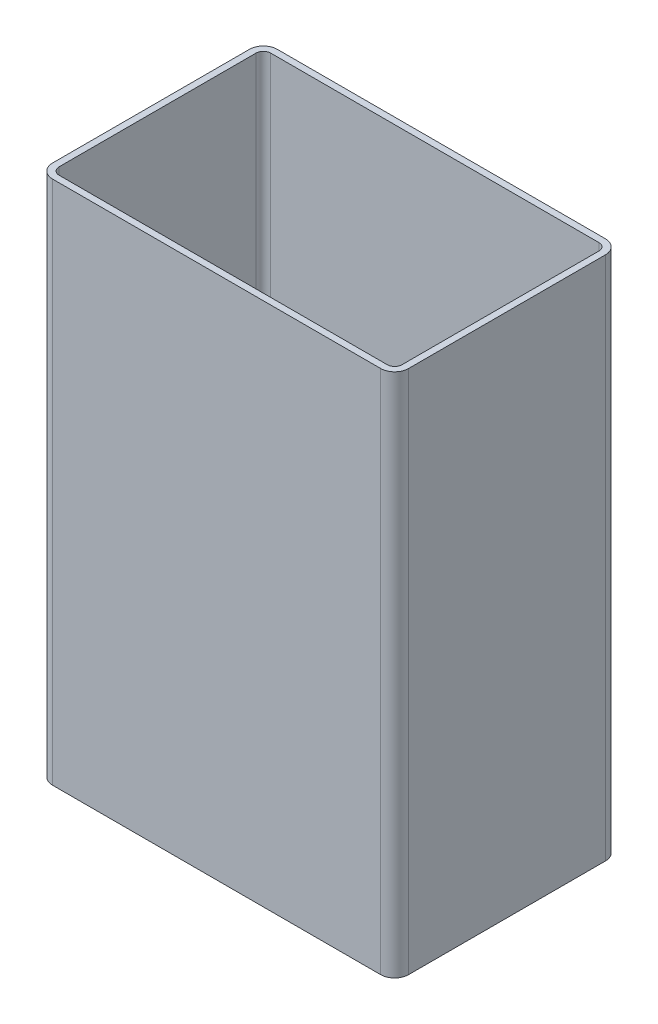
ISO-10303-21;
HEADER;
FILE_DESCRIPTION(('STEP AP214'),'2;1');
FILE_NAME('part.step','',(''),(''),'','','');
FILE_SCHEMA(('AUTOMOTIVE_DESIGN { 1 0 10303 214 1 1 1 1 }'));
ENDSEC;
DATA;
#1=APPLICATION_CONTEXT('core data for automotive mechanical design processes');
#2=APPLICATION_PROTOCOL_DEFINITION('international standard','automotive_design',2000,#1);
#3=PRODUCT_CONTEXT('',#1,'mechanical');
#4=PRODUCT('Part','Part','',(#3));
#5=PRODUCT_RELATED_PRODUCT_CATEGORY('part','',(#4));
#6=PRODUCT_DEFINITION_FORMATION('','',#4);
#7=PRODUCT_DEFINITION_CONTEXT('part definition',#1,'design');
#8=PRODUCT_DEFINITION('design','',#6,#7);
#9=PRODUCT_DEFINITION_SHAPE('','',#8);
#10=(LENGTH_UNIT() NAMED_UNIT(*) SI_UNIT(.MILLI.,.METRE.));
#11=(NAMED_UNIT(*) PLANE_ANGLE_UNIT() SI_UNIT($,.RADIAN.));
#12=(NAMED_UNIT(*) SI_UNIT($,.STERADIAN.) SOLID_ANGLE_UNIT());
#13=UNCERTAINTY_MEASURE_WITH_UNIT(LENGTH_MEASURE(1.E-05),#10,'distance_accuracy_value','');
#14=(GEOMETRIC_REPRESENTATION_CONTEXT(3) GLOBAL_UNCERTAINTY_ASSIGNED_CONTEXT((#13)) GLOBAL_UNIT_ASSIGNED_CONTEXT((#10,
#11,#12)) REPRESENTATION_CONTEXT('',''));
#15=CARTESIAN_POINT('',(0.,0.,0.));
#16=DIRECTION('',(0.,0.,1.));
#17=DIRECTION('',(1.,0.,0.));
#18=AXIS2_PLACEMENT_3D('',#15,#16,#17);
#19=CARTESIAN_POINT('',(0.,-609.6,-16.1798));
#20=DIRECTION('',(0.,1.,0.));
#21=DIRECTION('',(0.,0.,1.));
#22=AXIS2_PLACEMENT_3D('',#19,#20,#21);
#23=CYLINDRICAL_SURFACE('',#22,16.1798);
#24=CARTESIAN_POINT('',(0.,0.,-16.1798));
#25=DIRECTION('',(0.,-1.,0.));
#26=DIRECTION('',(0.,0.,-1.));
#27=AXIS2_PLACEMENT_3D('',#24,#25,#26);
#28=CIRCLE('',#27,16.1798);
#29=CARTESIAN_POINT('',(0.,0.,0.));
#30=VERTEX_POINT('',#29);
#31=CARTESIAN_POINT('',(-16.1798,0.,-16.1798));
#32=VERTEX_POINT('',#31);
#33=EDGE_CURVE('E142',#30,#32,#28,.T.);
#34=ORIENTED_EDGE('',*,*,#33,.T.);
#35=DIRECTION('',(0.,1.,0.));
#36=VECTOR('',#35,1.);
#37=CARTESIAN_POINT('',(-16.1798,-609.6,-16.1798));
#38=LINE('',#37,#36);
#39=CARTESIAN_POINT('',(-16.1798,-609.6,-16.1798));
#40=VERTEX_POINT('',#39);
#41=EDGE_CURVE('E11',#40,#32,#38,.T.);
#42=ORIENTED_EDGE('',*,*,#41,.F.);
#43=CARTESIAN_POINT('',(0.,-609.6,-16.1798));
#44=DIRECTION('',(0.,-1.,0.));
#45=DIRECTION('',(0.,0.,-1.));
#46=AXIS2_PLACEMENT_3D('',#43,#44,#45);
#47=CIRCLE('',#46,16.1798);
#48=CARTESIAN_POINT('',(0.,-609.6,0.));
#49=VERTEX_POINT('',#48);
#50=EDGE_CURVE('E162',#49,#40,#47,.T.);
#51=ORIENTED_EDGE('',*,*,#50,.F.);
#52=DIRECTION('',(0.,1.,0.));
#53=VECTOR('',#52,1.);
#54=CARTESIAN_POINT('',(0.,-609.6,0.));
#55=LINE('',#54,#53);
#56=EDGE_CURVE('E56',#49,#30,#55,.T.);
#57=ORIENTED_EDGE('',*,*,#56,.T.);
#58=EDGE_LOOP('',(#34,#42,#51,#57));
#59=FACE_BOUND('',#58,.T.);
#60=ADVANCED_FACE('F33',(#59),#23,.T.);
#61=CARTESIAN_POINT('',(-16.1798,-609.6,-16.1798));
#62=DIRECTION('',(1.,0.,0.));
#63=DIRECTION('',(0.,0.,-1.));
#64=AXIS2_PLACEMENT_3D('',#61,#62,#63);
#65=PLANE('',#64);
#66=DIRECTION('',(0.,0.,-1.));
#67=VECTOR('',#66,1.);
#68=CARTESIAN_POINT('',(-16.1798,0.,-16.1798));
#69=LINE('',#68,#67);
#70=CARTESIAN_POINT('',(-16.1798,0.,-244.7798));
#71=VERTEX_POINT('',#70);
#72=EDGE_CURVE('E144',#32,#71,#69,.T.);
#73=ORIENTED_EDGE('',*,*,#72,.T.);
#74=DIRECTION('',(0.,1.,0.));
#75=VECTOR('',#74,1.);
#76=CARTESIAN_POINT('',(-16.1798,-609.6,-244.7798));
#77=LINE('',#76,#75);
#78=CARTESIAN_POINT('',(-16.1798,-609.6,-244.7798));
#79=VERTEX_POINT('',#78);
#80=EDGE_CURVE('E40',#79,#71,#77,.T.);
#81=ORIENTED_EDGE('',*,*,#80,.F.);
#82=DIRECTION('',(0.,0.,-1.));
#83=VECTOR('',#82,1.);
#84=CARTESIAN_POINT('',(-16.1798,-609.6,-16.1798));
#85=LINE('',#84,#83);
#86=EDGE_CURVE('E95',#40,#79,#85,.T.);
#87=ORIENTED_EDGE('',*,*,#86,.F.);
#88=ORIENTED_EDGE('',*,*,#41,.T.);
#89=EDGE_LOOP('',(#73,#81,#87,#88));
#90=FACE_BOUND('',#89,.T.);
#91=ADVANCED_FACE('F176',(#90),#65,.F.);
#92=CARTESIAN_POINT('',(0.,-609.6,-244.7798));
#93=DIRECTION('',(0.,1.,0.));
#94=DIRECTION('',(0.,0.,1.));
#95=AXIS2_PLACEMENT_3D('',#92,#93,#94);
#96=CYLINDRICAL_SURFACE('',#95,16.1798);
#97=CARTESIAN_POINT('',(0.,0.,-244.7798));
#98=DIRECTION('',(0.,1.,0.));
#99=DIRECTION('',(0.,0.,1.));
#100=AXIS2_PLACEMENT_3D('',#97,#98,#99);
#101=CIRCLE('',#100,16.1798);
#102=CARTESIAN_POINT('',(0.,0.,-260.9596));
#103=VERTEX_POINT('',#102);
#104=EDGE_CURVE('E148',#103,#71,#101,.T.);
#105=ORIENTED_EDGE('',*,*,#104,.F.);
#106=DIRECTION('',(0.,1.,0.));
#107=VECTOR('',#106,1.);
#108=CARTESIAN_POINT('',(0.,-609.6,-260.9596));
#109=LINE('',#108,#107);
#110=CARTESIAN_POINT('',(0.,-609.6,-260.9596));
#111=VERTEX_POINT('',#110);
#112=EDGE_CURVE('E169',#111,#103,#109,.T.);
#113=ORIENTED_EDGE('',*,*,#112,.F.);
#114=CARTESIAN_POINT('',(0.,-609.6,-244.7798));
#115=DIRECTION('',(0.,1.,0.));
#116=DIRECTION('',(0.,0.,1.));
#117=AXIS2_PLACEMENT_3D('',#114,#115,#116);
#118=CIRCLE('',#117,16.1798);
#119=EDGE_CURVE('E175',#111,#79,#118,.T.);
#120=ORIENTED_EDGE('',*,*,#119,.T.);
#121=ORIENTED_EDGE('',*,*,#80,.T.);
#122=EDGE_LOOP('',(#105,#113,#120,#121));
#123=FACE_BOUND('',#122,.T.);
#124=ADVANCED_FACE('F173',(#123),#96,.T.);
#125=CARTESIAN_POINT('',(0.,-609.6,-260.9596));
#126=DIRECTION('',(0.,0.,1.));
#127=DIRECTION('',(1.,0.,0.));
#128=AXIS2_PLACEMENT_3D('',#125,#126,#127);
#129=PLANE('',#128);
#130=DIRECTION('',(1.,0.,0.));
#131=VECTOR('',#130,1.);
#132=CARTESIAN_POINT('',(0.,0.,-260.9596));
#133=LINE('',#132,#131);
#134=CARTESIAN_POINT('',(381.,0.,-260.9596));
#135=VERTEX_POINT('',#134);
#136=EDGE_CURVE('E151',#103,#135,#133,.T.);
#137=ORIENTED_EDGE('',*,*,#136,.T.);
#138=DIRECTION('',(0.,1.,0.));
#139=VECTOR('',#138,1.);
#140=CARTESIAN_POINT('',(381.,-609.6,-260.9596));
#141=LINE('',#140,#139);
#142=CARTESIAN_POINT('',(381.,-609.6,-260.9596));
#143=VERTEX_POINT('',#142);
#144=EDGE_CURVE('E166',#143,#135,#141,.T.);
#145=ORIENTED_EDGE('',*,*,#144,.F.);
#146=DIRECTION('',(1.,0.,0.));
#147=VECTOR('',#146,1.);
#148=CARTESIAN_POINT('',(0.,-609.6,-260.9596));
#149=LINE('',#148,#147);
#150=EDGE_CURVE('E188',#111,#143,#149,.T.);
#151=ORIENTED_EDGE('',*,*,#150,.F.);
#152=ORIENTED_EDGE('',*,*,#112,.T.);
#153=EDGE_LOOP('',(#137,#145,#151,#152));
#154=FACE_BOUND('',#153,.T.);
#155=ADVANCED_FACE('F184',(#154),#129,.F.);
#156=CARTESIAN_POINT('',(381.,-609.6,-244.7798));
#157=DIRECTION('',(0.,1.,0.));
#158=DIRECTION('',(0.,0.,1.));
#159=AXIS2_PLACEMENT_3D('',#156,#157,#158);
#160=CYLINDRICAL_SURFACE('',#159,16.1798);
#161=CARTESIAN_POINT('',(381.,0.,-244.7798));
#162=DIRECTION('',(0.,-1.,0.));
#163=DIRECTION('',(0.,0.,-1.));
#164=AXIS2_PLACEMENT_3D('',#161,#162,#163);
#165=CIRCLE('',#164,16.1798);
#166=CARTESIAN_POINT('',(397.1798,0.,-244.7798));
#167=VERTEX_POINT('',#166);
#168=EDGE_CURVE('E153',#135,#167,#165,.T.);
#169=ORIENTED_EDGE('',*,*,#168,.T.);
#170=DIRECTION('',(0.,1.,0.));
#171=VECTOR('',#170,1.);
#172=CARTESIAN_POINT('',(397.1798,-609.6,-244.7798));
#173=LINE('',#172,#171);
#174=CARTESIAN_POINT('',(397.1798,-609.6,-244.7798));
#175=VERTEX_POINT('',#174);
#176=EDGE_CURVE('E124',#175,#167,#173,.T.);
#177=ORIENTED_EDGE('',*,*,#176,.F.);
#178=CARTESIAN_POINT('',(381.,-609.6,-244.7798));
#179=DIRECTION('',(0.,-1.,0.));
#180=DIRECTION('',(0.,0.,-1.));
#181=AXIS2_PLACEMENT_3D('',#178,#179,#180);
#182=CIRCLE('',#181,16.1798);
#183=EDGE_CURVE('E133',#143,#175,#182,.T.);
#184=ORIENTED_EDGE('',*,*,#183,.F.);
#185=ORIENTED_EDGE('',*,*,#144,.T.);
#186=EDGE_LOOP('',(#169,#177,#184,#185));
#187=FACE_BOUND('',#186,.T.);
#188=ADVANCED_FACE('F187',(#187),#160,.T.);
#189=CARTESIAN_POINT('',(397.1798,-609.6,-16.1798));
#190=DIRECTION('',(1.,0.,0.));
#191=DIRECTION('',(0.,0.,-1.));
#192=AXIS2_PLACEMENT_3D('',#189,#190,#191);
#193=PLANE('',#192);
#194=DIRECTION('',(0.,0.,-1.));
#195=VECTOR('',#194,1.);
#196=CARTESIAN_POINT('',(397.1798,0.,-16.1798));
#197=LINE('',#196,#195);
#198=CARTESIAN_POINT('',(397.1798,0.,-16.1798));
#199=VERTEX_POINT('',#198);
#200=EDGE_CURVE('E119',#199,#167,#197,.T.);
#201=ORIENTED_EDGE('',*,*,#200,.F.);
#202=DIRECTION('',(0.,1.,0.));
#203=VECTOR('',#202,1.);
#204=CARTESIAN_POINT('',(397.1798,-609.6,-16.1798));
#205=LINE('',#204,#203);
#206=CARTESIAN_POINT('',(397.1798,-609.6,-16.1798));
#207=VERTEX_POINT('',#206);
#208=EDGE_CURVE('E114',#207,#199,#205,.T.);
#209=ORIENTED_EDGE('',*,*,#208,.F.);
#210=DIRECTION('',(0.,0.,-1.));
#211=VECTOR('',#210,1.);
#212=CARTESIAN_POINT('',(397.1798,-609.6,-16.1798));
#213=LINE('',#212,#211);
#214=EDGE_CURVE('E117',#207,#175,#213,.T.);
#215=ORIENTED_EDGE('',*,*,#214,.T.);
#216=ORIENTED_EDGE('',*,*,#176,.T.);
#217=EDGE_LOOP('',(#201,#209,#215,#216));
#218=FACE_BOUND('',#217,.T.);
#219=ADVANCED_FACE('F116',(#218),#193,.T.);
#220=CARTESIAN_POINT('',(381.,-609.6,-16.1798));
#221=DIRECTION('',(0.,1.,0.));
#222=DIRECTION('',(0.,0.,1.));
#223=AXIS2_PLACEMENT_3D('',#220,#221,#222);
#224=CYLINDRICAL_SURFACE('',#223,16.1798);
#225=CARTESIAN_POINT('',(381.,0.,-16.1798));
#226=DIRECTION('',(0.,1.,0.));
#227=DIRECTION('',(0.,0.,1.));
#228=AXIS2_PLACEMENT_3D('',#225,#226,#227);
#229=CIRCLE('',#228,16.1798);
#230=CARTESIAN_POINT('',(381.,0.,0.));
#231=VERTEX_POINT('',#230);
#232=EDGE_CURVE('E157',#231,#199,#229,.T.);
#233=ORIENTED_EDGE('',*,*,#232,.F.);
#234=DIRECTION('',(0.,1.,0.));
#235=VECTOR('',#234,1.);
#236=CARTESIAN_POINT('',(381.,-609.6,0.));
#237=LINE('',#236,#235);
#238=CARTESIAN_POINT('',(381.,-609.6,0.));
#239=VERTEX_POINT('',#238);
#240=EDGE_CURVE('E125',#239,#231,#237,.T.);
#241=ORIENTED_EDGE('',*,*,#240,.F.);
#242=CARTESIAN_POINT('',(381.,-609.6,-16.1798));
#243=DIRECTION('',(0.,1.,0.));
#244=DIRECTION('',(0.,0.,1.));
#245=AXIS2_PLACEMENT_3D('',#242,#243,#244);
#246=CIRCLE('',#245,16.1798);
#247=EDGE_CURVE('E131',#239,#207,#246,.T.);
#248=ORIENTED_EDGE('',*,*,#247,.T.);
#249=ORIENTED_EDGE('',*,*,#208,.T.);
#250=EDGE_LOOP('',(#233,#241,#248,#249));
#251=FACE_BOUND('',#250,.T.);
#252=ADVANCED_FACE('F136',(#251),#224,.T.);
#253=CARTESIAN_POINT('',(0.,-609.6,0.));
#254=DIRECTION('',(0.,0.,1.));
#255=DIRECTION('',(1.,0.,0.));
#256=AXIS2_PLACEMENT_3D('',#253,#254,#255);
#257=PLANE('',#256);
#258=DIRECTION('',(1.,0.,0.));
#259=VECTOR('',#258,1.);
#260=CARTESIAN_POINT('',(0.,0.,0.));
#261=LINE('',#260,#259);
#262=EDGE_CURVE('E159',#30,#231,#261,.T.);
#263=ORIENTED_EDGE('',*,*,#262,.F.);
#264=ORIENTED_EDGE('',*,*,#56,.F.);
#265=DIRECTION('',(1.,0.,0.));
#266=VECTOR('',#265,1.);
#267=CARTESIAN_POINT('',(0.,-609.6,0.));
#268=LINE('',#267,#266);
#269=EDGE_CURVE('E137',#49,#239,#268,.T.);
#270=ORIENTED_EDGE('',*,*,#269,.T.);
#271=ORIENTED_EDGE('',*,*,#240,.T.);
#272=EDGE_LOOP('',(#263,#264,#270,#271));
#273=FACE_BOUND('',#272,.T.);
#274=ADVANCED_FACE('F327',(#273),#257,.T.);
#275=CARTESIAN_POINT('',(0.,-609.6,-16.1798));
#276=DIRECTION('',(0.,-1.,0.));
#277=DIRECTION('',(0.,0.,-1.));
#278=AXIS2_PLACEMENT_3D('',#275,#276,#277);
#279=PLANE('',#278);
#280=ORIENTED_EDGE('',*,*,#50,.T.);
#281=ORIENTED_EDGE('',*,*,#86,.T.);
#282=ORIENTED_EDGE('',*,*,#119,.F.);
#283=ORIENTED_EDGE('',*,*,#150,.T.);
#284=ORIENTED_EDGE('',*,*,#183,.T.);
#285=ORIENTED_EDGE('',*,*,#214,.F.);
#286=ORIENTED_EDGE('',*,*,#247,.F.);
#287=ORIENTED_EDGE('',*,*,#269,.F.);
#288=EDGE_LOOP('',(#280,#281,#282,#283,#284,#285,#286,#287));
#289=FACE_BOUND('',#288,.T.);
#290=ADVANCED_FACE('F129',(#289),#279,.T.);
#291=CARTESIAN_POINT('',(0.,0.,-16.1798));
#292=DIRECTION('',(0.,-1.,0.));
#293=DIRECTION('',(0.,0.,-1.));
#294=AXIS2_PLACEMENT_3D('',#291,#292,#293);
#295=PLANE('',#294);
#296=DIRECTION('',(1.,0.,0.));
#297=VECTOR('',#296,1.);
#298=CARTESIAN_POINT('',(0.,0.,-7.62));
#299=LINE('',#298,#297);
#300=CARTESIAN_POINT('',(0.,-2.22044604925031E-13,-7.62000000000002));
#301=VERTEX_POINT('',#300);
#302=CARTESIAN_POINT('',(381.,-2.22044604925031E-13,-7.62));
#303=VERTEX_POINT('',#302);
#304=EDGE_CURVE('E211',#301,#303,#299,.T.);
#305=ORIENTED_EDGE('',*,*,#304,.F.);
#306=CARTESIAN_POINT('',(0.,0.,-16.1798));
#307=DIRECTION('',(0.,-1.,0.));
#308=DIRECTION('',(0.,0.,-1.));
#309=AXIS2_PLACEMENT_3D('',#306,#307,#308);
#310=CIRCLE('',#309,8.55979999999998);
#311=CARTESIAN_POINT('',(-8.55979999999997,-2.22044604925031E-13,-16.1798));
#312=VERTEX_POINT('',#311);
#313=EDGE_CURVE('E197',#301,#312,#310,.T.);
#314=ORIENTED_EDGE('',*,*,#313,.T.);
#315=DIRECTION('',(0.,0.,-1.));
#316=VECTOR('',#315,1.);
#317=CARTESIAN_POINT('',(-8.55979999999997,0.,-16.1798));
#318=LINE('',#317,#316);
#319=CARTESIAN_POINT('',(-8.55979999999998,-2.22044604925031E-13,-244.7798));
#320=VERTEX_POINT('',#319);
#321=EDGE_CURVE('E194',#312,#320,#318,.T.);
#322=ORIENTED_EDGE('',*,*,#321,.T.);
#323=CARTESIAN_POINT('',(0.,0.,-244.7798));
#324=DIRECTION('',(0.,-1.,0.));
#325=DIRECTION('',(0.,0.,-1.));
#326=AXIS2_PLACEMENT_3D('',#323,#324,#325);
#327=CIRCLE('',#326,8.55979999999998);
#328=CARTESIAN_POINT('',(0.,-2.22044604925031E-13,-253.3396));
#329=VERTEX_POINT('',#328);
#330=EDGE_CURVE('E47',#329,#320,#327,.F.);
#331=ORIENTED_EDGE('',*,*,#330,.F.);
#332=DIRECTION('',(1.,0.,0.));
#333=VECTOR('',#332,1.);
#334=CARTESIAN_POINT('',(0.,0.,-253.3396));
#335=LINE('',#334,#333);
#336=CARTESIAN_POINT('',(381.,-2.22044604925031E-13,-253.3396));
#337=VERTEX_POINT('',#336);
#338=EDGE_CURVE('E199',#329,#337,#335,.T.);
#339=ORIENTED_EDGE('',*,*,#338,.T.);
#340=CARTESIAN_POINT('',(381.,0.,-244.7798));
#341=DIRECTION('',(0.,-1.,0.));
#342=DIRECTION('',(0.,0.,-1.));
#343=AXIS2_PLACEMENT_3D('',#340,#341,#342);
#344=CIRCLE('',#343,8.55979999999998);
#345=CARTESIAN_POINT('',(389.5598,-2.22044604925031E-13,-244.7798));
#346=VERTEX_POINT('',#345);
#347=EDGE_CURVE('E202',#337,#346,#344,.T.);
#348=ORIENTED_EDGE('',*,*,#347,.T.);
#349=DIRECTION('',(0.,0.,-1.));
#350=VECTOR('',#349,1.);
#351=CARTESIAN_POINT('',(389.5598,0.,-16.1798));
#352=LINE('',#351,#350);
#353=CARTESIAN_POINT('',(389.5598,-2.22044604925031E-13,-16.1798));
#354=VERTEX_POINT('',#353);
#355=EDGE_CURVE('E205',#354,#346,#352,.T.);
#356=ORIENTED_EDGE('',*,*,#355,.F.);
#357=CARTESIAN_POINT('',(381.,0.,-16.1798));
#358=DIRECTION('',(0.,-1.,0.));
#359=DIRECTION('',(0.,0.,-1.));
#360=AXIS2_PLACEMENT_3D('',#357,#358,#359);
#361=CIRCLE('',#360,8.55979999999998);
#362=EDGE_CURVE('E208',#303,#354,#361,.F.);
#363=ORIENTED_EDGE('',*,*,#362,.F.);
#364=EDGE_LOOP('',(#305,#314,#322,#331,#339,#348,#356,#363));
#365=FACE_BOUND('',#364,.T.);
#366=ORIENTED_EDGE('',*,*,#33,.F.);
#367=ORIENTED_EDGE('',*,*,#262,.T.);
#368=ORIENTED_EDGE('',*,*,#232,.T.);
#369=ORIENTED_EDGE('',*,*,#200,.T.);
#370=ORIENTED_EDGE('',*,*,#168,.F.);
#371=ORIENTED_EDGE('',*,*,#136,.F.);
#372=ORIENTED_EDGE('',*,*,#104,.T.);
#373=ORIENTED_EDGE('',*,*,#72,.F.);
#374=EDGE_LOOP('',(#366,#367,#368,#369,#370,#371,#372,#373));
#375=FACE_BOUND('',#374,.T.);
#376=ADVANCED_FACE('F180',(#365,#375),#295,.F.);
#377=CARTESIAN_POINT('',(0.,-609.6,-16.1798));
#378=DIRECTION('',(0.,1.,0.));
#379=DIRECTION('',(0.,0.,1.));
#380=AXIS2_PLACEMENT_3D('',#377,#378,#379);
#381=CYLINDRICAL_SURFACE('',#380,8.55979999999998);
#382=ORIENTED_EDGE('',*,*,#313,.F.);
#383=DIRECTION('',(0.,1.,0.));
#384=VECTOR('',#383,1.);
#385=CARTESIAN_POINT('',(0.,-609.6,-7.62000000000002));
#386=LINE('',#385,#384);
#387=CARTESIAN_POINT('',(0.,-601.98,-7.62000000000002));
#388=VERTEX_POINT('',#387);
#389=EDGE_CURVE('E220',#388,#301,#386,.T.);
#390=ORIENTED_EDGE('',*,*,#389,.F.);
#391=CARTESIAN_POINT('',(0.,-601.98,-16.1798));
#392=DIRECTION('',(0.,-1.,0.));
#393=DIRECTION('',(0.,0.,-1.));
#394=AXIS2_PLACEMENT_3D('',#391,#392,#393);
#395=CIRCLE('',#394,8.55979999999998);
#396=CARTESIAN_POINT('',(-8.55979999999997,-601.98,-16.1798));
#397=VERTEX_POINT('',#396);
#398=EDGE_CURVE('E214',#388,#397,#395,.T.);
#399=ORIENTED_EDGE('',*,*,#398,.T.);
#400=DIRECTION('',(0.,1.,0.));
#401=VECTOR('',#400,1.);
#402=CARTESIAN_POINT('',(-8.55979999999997,-609.6,-16.1798));
#403=LINE('',#402,#401);
#404=EDGE_CURVE('E145',#397,#312,#403,.T.);
#405=ORIENTED_EDGE('',*,*,#404,.T.);
#406=EDGE_LOOP('',(#382,#390,#399,#405));
#407=FACE_BOUND('',#406,.T.);
#408=ADVANCED_FACE('F263',(#407),#381,.F.);
#409=CARTESIAN_POINT('',(-8.55979999999997,-609.6,-16.1798));
#410=DIRECTION('',(1.,0.,0.));
#411=DIRECTION('',(0.,0.,-1.));
#412=AXIS2_PLACEMENT_3D('',#409,#410,#411);
#413=PLANE('',#412);
#414=ORIENTED_EDGE('',*,*,#321,.F.);
#415=ORIENTED_EDGE('',*,*,#404,.F.);
#416=DIRECTION('',(0.,0.,-1.));
#417=VECTOR('',#416,1.);
#418=CARTESIAN_POINT('',(-8.55979999999997,-601.98,-16.1798));
#419=LINE('',#418,#417);
#420=CARTESIAN_POINT('',(-8.55979999999998,-601.98,-244.7798));
#421=VERTEX_POINT('',#420);
#422=EDGE_CURVE('E249',#397,#421,#419,.T.);
#423=ORIENTED_EDGE('',*,*,#422,.T.);
#424=DIRECTION('',(0.,1.,0.));
#425=VECTOR('',#424,1.);
#426=CARTESIAN_POINT('',(-8.55979999999998,-609.6,-244.7798));
#427=LINE('',#426,#425);
#428=EDGE_CURVE('E251',#421,#320,#427,.T.);
#429=ORIENTED_EDGE('',*,*,#428,.T.);
#430=EDGE_LOOP('',(#414,#415,#423,#429));
#431=FACE_BOUND('',#430,.T.);
#432=ADVANCED_FACE('F391',(#431),#413,.T.);
#433=CARTESIAN_POINT('',(0.,-609.6,-244.7798));
#434=DIRECTION('',(0.,1.,0.));
#435=DIRECTION('',(0.,0.,1.));
#436=AXIS2_PLACEMENT_3D('',#433,#434,#435);
#437=CYLINDRICAL_SURFACE('',#436,8.55979999999998);
#438=ORIENTED_EDGE('',*,*,#330,.T.);
#439=ORIENTED_EDGE('',*,*,#428,.F.);
#440=CARTESIAN_POINT('',(0.,-601.98,-244.7798));
#441=DIRECTION('',(0.,-1.,0.));
#442=DIRECTION('',(0.,0.,-1.));
#443=AXIS2_PLACEMENT_3D('',#440,#441,#442);
#444=CIRCLE('',#443,8.55979999999998);
#445=CARTESIAN_POINT('',(0.,-601.98,-253.3396));
#446=VERTEX_POINT('',#445);
#447=EDGE_CURVE('E243',#446,#421,#444,.F.);
#448=ORIENTED_EDGE('',*,*,#447,.F.);
#449=DIRECTION('',(0.,1.,0.));
#450=VECTOR('',#449,1.);
#451=CARTESIAN_POINT('',(0.,-609.6,-253.3396));
#452=LINE('',#451,#450);
#453=EDGE_CURVE('E246',#446,#329,#452,.T.);
#454=ORIENTED_EDGE('',*,*,#453,.T.);
#455=EDGE_LOOP('',(#438,#439,#448,#454));
#456=FACE_BOUND('',#455,.T.);
#457=ADVANCED_FACE('F295',(#456),#437,.F.);
#458=CARTESIAN_POINT('',(0.,-609.6,-253.3396));
#459=DIRECTION('',(0.,0.,1.));
#460=DIRECTION('',(1.,0.,0.));
#461=AXIS2_PLACEMENT_3D('',#458,#459,#460);
#462=PLANE('',#461);
#463=ORIENTED_EDGE('',*,*,#338,.F.);
#464=ORIENTED_EDGE('',*,*,#453,.F.);
#465=DIRECTION('',(1.,0.,0.));
#466=VECTOR('',#465,1.);
#467=CARTESIAN_POINT('',(0.,-601.98,-253.3396));
#468=LINE('',#467,#466);
#469=CARTESIAN_POINT('',(381.,-601.98,-253.3396));
#470=VERTEX_POINT('',#469);
#471=EDGE_CURVE('E237',#446,#470,#468,.T.);
#472=ORIENTED_EDGE('',*,*,#471,.T.);
#473=DIRECTION('',(0.,1.,0.));
#474=VECTOR('',#473,1.);
#475=CARTESIAN_POINT('',(381.,-609.6,-253.3396));
#476=LINE('',#475,#474);
#477=EDGE_CURVE('E240',#470,#337,#476,.T.);
#478=ORIENTED_EDGE('',*,*,#477,.T.);
#479=EDGE_LOOP('',(#463,#464,#472,#478));
#480=FACE_BOUND('',#479,.T.);
#481=ADVANCED_FACE('F299',(#480),#462,.T.);
#482=CARTESIAN_POINT('',(381.,-609.6,-244.7798));
#483=DIRECTION('',(0.,1.,0.));
#484=DIRECTION('',(0.,0.,1.));
#485=AXIS2_PLACEMENT_3D('',#482,#483,#484);
#486=CYLINDRICAL_SURFACE('',#485,8.55979999999998);
#487=ORIENTED_EDGE('',*,*,#347,.F.);
#488=ORIENTED_EDGE('',*,*,#477,.F.);
#489=CARTESIAN_POINT('',(381.,-601.98,-244.7798));
#490=DIRECTION('',(0.,-1.,0.));
#491=DIRECTION('',(0.,0.,-1.));
#492=AXIS2_PLACEMENT_3D('',#489,#490,#491);
#493=CIRCLE('',#492,8.55979999999998);
#494=CARTESIAN_POINT('',(389.5598,-601.98,-244.7798));
#495=VERTEX_POINT('',#494);
#496=EDGE_CURVE('E231',#470,#495,#493,.T.);
#497=ORIENTED_EDGE('',*,*,#496,.T.);
#498=DIRECTION('',(0.,1.,0.));
#499=VECTOR('',#498,1.);
#500=CARTESIAN_POINT('',(389.5598,-609.6,-244.7798));
#501=LINE('',#500,#499);
#502=EDGE_CURVE('E234',#495,#346,#501,.T.);
#503=ORIENTED_EDGE('',*,*,#502,.T.);
#504=EDGE_LOOP('',(#487,#488,#497,#503));
#505=FACE_BOUND('',#504,.T.);
#506=ADVANCED_FACE('F303',(#505),#486,.F.);
#507=CARTESIAN_POINT('',(389.5598,-609.6,-16.1798));
#508=DIRECTION('',(1.,0.,0.));
#509=DIRECTION('',(0.,0.,-1.));
#510=AXIS2_PLACEMENT_3D('',#507,#508,#509);
#511=PLANE('',#510);
#512=ORIENTED_EDGE('',*,*,#355,.T.);
#513=ORIENTED_EDGE('',*,*,#502,.F.);
#514=DIRECTION('',(0.,0.,-1.));
#515=VECTOR('',#514,1.);
#516=CARTESIAN_POINT('',(389.5598,-601.98,-16.1798));
#517=LINE('',#516,#515);
#518=CARTESIAN_POINT('',(389.5598,-601.98,-16.1798));
#519=VERTEX_POINT('',#518);
#520=EDGE_CURVE('E224',#519,#495,#517,.T.);
#521=ORIENTED_EDGE('',*,*,#520,.F.);
#522=DIRECTION('',(0.,1.,0.));
#523=VECTOR('',#522,1.);
#524=CARTESIAN_POINT('',(389.5598,-609.6,-16.1798));
#525=LINE('',#524,#523);
#526=EDGE_CURVE('E228',#519,#354,#525,.T.);
#527=ORIENTED_EDGE('',*,*,#526,.T.);
#528=EDGE_LOOP('',(#512,#513,#521,#527));
#529=FACE_BOUND('',#528,.T.);
#530=ADVANCED_FACE('F310',(#529),#511,.F.);
#531=CARTESIAN_POINT('',(381.,-609.6,-16.1798));
#532=DIRECTION('',(0.,1.,0.));
#533=DIRECTION('',(0.,0.,1.));
#534=AXIS2_PLACEMENT_3D('',#531,#532,#533);
#535=CYLINDRICAL_SURFACE('',#534,8.55979999999998);
#536=ORIENTED_EDGE('',*,*,#362,.T.);
#537=ORIENTED_EDGE('',*,*,#526,.F.);
#538=CARTESIAN_POINT('',(381.,-601.98,-16.1798));
#539=DIRECTION('',(0.,-1.,0.));
#540=DIRECTION('',(0.,0.,-1.));
#541=AXIS2_PLACEMENT_3D('',#538,#539,#540);
#542=CIRCLE('',#541,8.55979999999998);
#543=CARTESIAN_POINT('',(381.,-601.98,-7.62));
#544=VERTEX_POINT('',#543);
#545=EDGE_CURVE('E221',#544,#519,#542,.F.);
#546=ORIENTED_EDGE('',*,*,#545,.F.);
#547=DIRECTION('',(0.,1.,0.));
#548=VECTOR('',#547,1.);
#549=CARTESIAN_POINT('',(381.,-609.6,-7.62));
#550=LINE('',#549,#548);
#551=EDGE_CURVE('E225',#544,#303,#550,.T.);
#552=ORIENTED_EDGE('',*,*,#551,.T.);
#553=EDGE_LOOP('',(#536,#537,#546,#552));
#554=FACE_BOUND('',#553,.T.);
#555=ADVANCED_FACE('F313',(#554),#535,.F.);
#556=CARTESIAN_POINT('',(0.,-609.6,-7.62));
#557=DIRECTION('',(0.,0.,1.));
#558=DIRECTION('',(1.,0.,0.));
#559=AXIS2_PLACEMENT_3D('',#556,#557,#558);
#560=PLANE('',#559);
#561=ORIENTED_EDGE('',*,*,#304,.T.);
#562=ORIENTED_EDGE('',*,*,#551,.F.);
#563=DIRECTION('',(1.,0.,0.));
#564=VECTOR('',#563,1.);
#565=CARTESIAN_POINT('',(0.,-601.98,-7.62));
#566=LINE('',#565,#564);
#567=EDGE_CURVE('E217',#388,#544,#566,.T.);
#568=ORIENTED_EDGE('',*,*,#567,.F.);
#569=ORIENTED_EDGE('',*,*,#389,.T.);
#570=EDGE_LOOP('',(#561,#562,#568,#569));
#571=FACE_BOUND('',#570,.T.);
#572=ADVANCED_FACE('F279',(#571),#560,.F.);
#573=CARTESIAN_POINT('',(0.,-601.98,-16.1798));
#574=DIRECTION('',(0.,-1.,0.));
#575=DIRECTION('',(0.,0.,-1.));
#576=AXIS2_PLACEMENT_3D('',#573,#574,#575);
#577=PLANE('',#576);
#578=ORIENTED_EDGE('',*,*,#398,.F.);
#579=ORIENTED_EDGE('',*,*,#567,.T.);
#580=ORIENTED_EDGE('',*,*,#545,.T.);
#581=ORIENTED_EDGE('',*,*,#520,.T.);
#582=ORIENTED_EDGE('',*,*,#496,.F.);
#583=ORIENTED_EDGE('',*,*,#471,.F.);
#584=ORIENTED_EDGE('',*,*,#447,.T.);
#585=ORIENTED_EDGE('',*,*,#422,.F.);
#586=EDGE_LOOP('',(#578,#579,#580,#581,#582,#583,#584,#585));
#587=FACE_BOUND('',#586,.T.);
#588=ADVANCED_FACE('F320',(#587),#577,.F.);
#589=CLOSED_SHELL('',(#60,#91,#124,#155,#188,#219,#252,#274,#290,#376,#408,#432,#457,#481,#506,
#530,#555,#572,#588));
#590=MANIFOLD_SOLID_BREP('B2',#589);
#591=ADVANCED_BREP_SHAPE_REPRESENTATION('',(#18,#590),#14);
#592=SHAPE_DEFINITION_REPRESENTATION(#9,#591);
ENDSEC;
END-ISO-10303-21;
